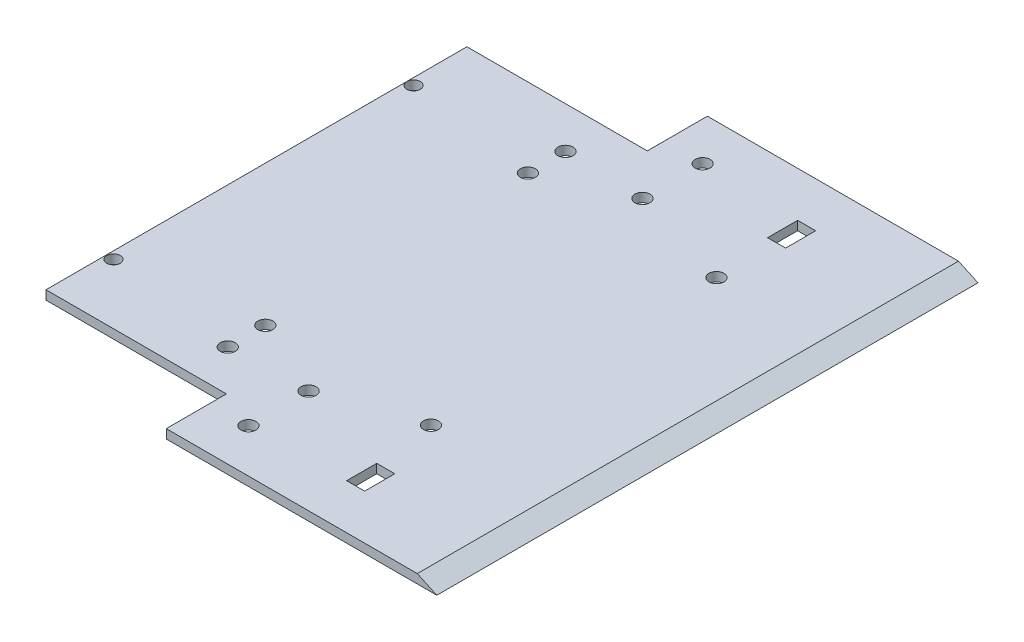
ISO-10303-21;
HEADER;
FILE_DESCRIPTION(('STEP AP214'),'2;1');
FILE_NAME('part.step','',(''),(''),'','','');
FILE_SCHEMA(('AUTOMOTIVE_DESIGN { 1 0 10303 214 1 1 1 1 }'));
ENDSEC;
DATA;
#1=APPLICATION_CONTEXT('core data for automotive mechanical design processes');
#2=APPLICATION_PROTOCOL_DEFINITION('international standard','automotive_design',2000,#1);
#3=PRODUCT_CONTEXT('',#1,'mechanical');
#4=PRODUCT('Part','Part','',(#3));
#5=PRODUCT_RELATED_PRODUCT_CATEGORY('part','',(#4));
#6=PRODUCT_DEFINITION_FORMATION('','',#4);
#7=PRODUCT_DEFINITION_CONTEXT('part definition',#1,'design');
#8=PRODUCT_DEFINITION('design','',#6,#7);
#9=PRODUCT_DEFINITION_SHAPE('','',#8);
#10=(LENGTH_UNIT() NAMED_UNIT(*) SI_UNIT(.MILLI.,.METRE.));
#11=(NAMED_UNIT(*) PLANE_ANGLE_UNIT() SI_UNIT($,.RADIAN.));
#12=(NAMED_UNIT(*) SI_UNIT($,.STERADIAN.) SOLID_ANGLE_UNIT());
#13=UNCERTAINTY_MEASURE_WITH_UNIT(LENGTH_MEASURE(1.E-05),#10,'distance_accuracy_value','');
#14=(GEOMETRIC_REPRESENTATION_CONTEXT(3) GLOBAL_UNCERTAINTY_ASSIGNED_CONTEXT((#13)) GLOBAL_UNIT_ASSIGNED_CONTEXT((#10,
#11,#12)) REPRESENTATION_CONTEXT('',''));
#15=CARTESIAN_POINT('',(0.,0.,0.));
#16=DIRECTION('',(0.,0.,1.));
#17=DIRECTION('',(1.,0.,0.));
#18=AXIS2_PLACEMENT_3D('',#15,#16,#17);
#19=CARTESIAN_POINT('',(0.,3.,-65.0000000000001));
#20=DIRECTION('',(0.,0.,1.));
#21=DIRECTION('',(1.,0.,0.));
#22=AXIS2_PLACEMENT_3D('',#19,#20,#21);
#23=PLANE('',#22);
#24=DIRECTION('',(-1.,0.,0.));
#25=VECTOR('',#24,1.);
#26=CARTESIAN_POINT('',(0.,0.,-65.0000000000001));
#27=LINE('',#26,#25);
#28=CARTESIAN_POINT('',(36.,0.,-65.0000000000001));
#29=VERTEX_POINT('',#28);
#30=CARTESIAN_POINT('',(30.,0.,-65.0000000000001));
#31=VERTEX_POINT('',#30);
#32=EDGE_CURVE('E252',#29,#31,#27,.T.);
#33=ORIENTED_EDGE('',*,*,#32,.T.);
#34=DIRECTION('',(0.,-1.,0.));
#35=VECTOR('',#34,1.);
#36=CARTESIAN_POINT('',(30.,3.,-65.0000000000001));
#37=LINE('',#36,#35);
#38=CARTESIAN_POINT('',(30.,3.,-65.0000000000001));
#39=VERTEX_POINT('',#38);
#40=EDGE_CURVE('E11',#39,#31,#37,.T.);
#41=ORIENTED_EDGE('',*,*,#40,.F.);
#42=DIRECTION('',(-1.,0.,0.));
#43=VECTOR('',#42,1.);
#44=CARTESIAN_POINT('',(0.,3.,-65.0000000000001));
#45=LINE('',#44,#43);
#46=CARTESIAN_POINT('',(36.,3.,-65.0000000000001));
#47=VERTEX_POINT('',#46);
#48=EDGE_CURVE('E162',#47,#39,#45,.T.);
#49=ORIENTED_EDGE('',*,*,#48,.F.);
#50=DIRECTION('',(0.,-1.,0.));
#51=VECTOR('',#50,1.);
#52=CARTESIAN_POINT('',(36.,3.,-65.0000000000001));
#53=LINE('',#52,#51);
#54=EDGE_CURVE('E60',#47,#29,#53,.T.);
#55=ORIENTED_EDGE('',*,*,#54,.T.);
#56=EDGE_LOOP('',(#33,#41,#49,#55));
#57=FACE_BOUND('',#56,.T.);
#58=ADVANCED_FACE('F41',(#57),#23,.F.);
#59=CARTESIAN_POINT('',(30.,3.,0.));
#60=DIRECTION('',(-1.,0.,0.));
#61=DIRECTION('',(0.,0.,1.));
#62=AXIS2_PLACEMENT_3D('',#59,#60,#61);
#63=PLANE('',#62);
#64=DIRECTION('',(0.,0.,-1.));
#65=VECTOR('',#64,1.);
#66=CARTESIAN_POINT('',(30.,0.,0.));
#67=LINE('',#66,#65);
#68=CARTESIAN_POINT('',(30.,0.,-75.0000000000001));
#69=VERTEX_POINT('',#68);
#70=EDGE_CURVE('E168',#31,#69,#67,.T.);
#71=ORIENTED_EDGE('',*,*,#70,.T.);
#72=DIRECTION('',(0.,-1.,0.));
#73=VECTOR('',#72,1.);
#74=CARTESIAN_POINT('',(30.,3.,-75.0000000000001));
#75=LINE('',#74,#73);
#76=CARTESIAN_POINT('',(30.,3.,-75.0000000000001));
#77=VERTEX_POINT('',#76);
#78=EDGE_CURVE('E51',#77,#69,#75,.T.);
#79=ORIENTED_EDGE('',*,*,#78,.F.);
#80=DIRECTION('',(0.,0.,-1.));
#81=VECTOR('',#80,1.);
#82=CARTESIAN_POINT('',(30.,3.,0.));
#83=LINE('',#82,#81);
#84=EDGE_CURVE('E156',#39,#77,#83,.T.);
#85=ORIENTED_EDGE('',*,*,#84,.F.);
#86=ORIENTED_EDGE('',*,*,#40,.T.);
#87=EDGE_LOOP('',(#71,#79,#85,#86));
#88=FACE_BOUND('',#87,.T.);
#89=ADVANCED_FACE('F167',(#88),#63,.F.);
#90=CARTESIAN_POINT('',(0.,3.,-75.0000000000001));
#91=DIRECTION('',(0.,0.,1.));
#92=DIRECTION('',(1.,0.,0.));
#93=AXIS2_PLACEMENT_3D('',#90,#91,#92);
#94=PLANE('',#93);
#95=DIRECTION('',(-1.,0.,0.));
#96=VECTOR('',#95,1.);
#97=CARTESIAN_POINT('',(0.,0.,-75.0000000000001));
#98=LINE('',#97,#96);
#99=CARTESIAN_POINT('',(36.,0.,-75.0000000000001));
#100=VERTEX_POINT('',#99);
#101=EDGE_CURVE('E255',#100,#69,#98,.T.);
#102=ORIENTED_EDGE('',*,*,#101,.F.);
#103=DIRECTION('',(0.,-1.,0.));
#104=VECTOR('',#103,1.);
#105=CARTESIAN_POINT('',(36.,3.,-75.0000000000001));
#106=LINE('',#105,#104);
#107=CARTESIAN_POINT('',(36.,3.,-75.0000000000001));
#108=VERTEX_POINT('',#107);
#109=EDGE_CURVE('E108',#108,#100,#106,.T.);
#110=ORIENTED_EDGE('',*,*,#109,.F.);
#111=DIRECTION('',(-1.,0.,0.));
#112=VECTOR('',#111,1.);
#113=CARTESIAN_POINT('',(0.,3.,-75.0000000000001));
#114=LINE('',#113,#112);
#115=EDGE_CURVE('E161',#108,#77,#114,.T.);
#116=ORIENTED_EDGE('',*,*,#115,.T.);
#117=ORIENTED_EDGE('',*,*,#78,.T.);
#118=EDGE_LOOP('',(#102,#110,#116,#117));
#119=FACE_BOUND('',#118,.T.);
#120=ADVANCED_FACE('F172',(#119),#94,.T.);
#121=CARTESIAN_POINT('',(-15.,3.,0.));
#122=DIRECTION('',(-1.,0.,0.));
#123=DIRECTION('',(0.,0.,1.));
#124=AXIS2_PLACEMENT_3D('',#121,#122,#123);
#125=PLANE('',#124);
#126=DIRECTION('',(0.,0.,-1.));
#127=VECTOR('',#126,1.);
#128=CARTESIAN_POINT('',(-15.,0.,0.));
#129=LINE('',#128,#127);
#130=CARTESIAN_POINT('',(-15.,0.,90.));
#131=VERTEX_POINT('',#130);
#132=CARTESIAN_POINT('',(-15.,0.,70.0000000000001));
#133=VERTEX_POINT('',#132);
#134=EDGE_CURVE('E228',#131,#133,#129,.T.);
#135=ORIENTED_EDGE('',*,*,#134,.F.);
#136=DIRECTION('',(0.,-1.,0.));
#137=VECTOR('',#136,1.);
#138=CARTESIAN_POINT('',(-15.,3.,90.));
#139=LINE('',#138,#137);
#140=CARTESIAN_POINT('',(-15.,3.,90.));
#141=VERTEX_POINT('',#140);
#142=EDGE_CURVE('E262',#141,#131,#139,.T.);
#143=ORIENTED_EDGE('',*,*,#142,.F.);
#144=DIRECTION('',(0.,0.,-1.));
#145=VECTOR('',#144,1.);
#146=CARTESIAN_POINT('',(-15.,3.,0.));
#147=LINE('',#146,#145);
#148=CARTESIAN_POINT('',(-15.,3.,70.0000000000001));
#149=VERTEX_POINT('',#148);
#150=EDGE_CURVE('E694',#141,#149,#147,.T.);
#151=ORIENTED_EDGE('',*,*,#150,.T.);
#152=DIRECTION('',(0.,-1.,0.));
#153=VECTOR('',#152,1.);
#154=CARTESIAN_POINT('',(-15.,3.,70.0000000000001));
#155=LINE('',#154,#153);
#156=EDGE_CURVE('E264',#149,#133,#155,.T.);
#157=ORIENTED_EDGE('',*,*,#156,.T.);
#158=EDGE_LOOP('',(#135,#143,#151,#157));
#159=FACE_BOUND('',#158,.T.);
#160=ADVANCED_FACE('F339',(#159),#125,.T.);
#161=CARTESIAN_POINT('',(0.,3.,90.));
#162=DIRECTION('',(0.,0.,1.));
#163=DIRECTION('',(1.,0.,0.));
#164=AXIS2_PLACEMENT_3D('',#161,#162,#163);
#165=PLANE('',#164);
#166=DIRECTION('',(0.907812771435628,-0.419375693165881,0.));
#167=VECTOR('',#166,1.);
#168=CARTESIAN_POINT('',(68.5059700438346,3.,90.));
#169=LINE('',#168,#167);
#170=CARTESIAN_POINT('',(68.5059700438346,3.,90.));
#171=VERTEX_POINT('',#170);
#172=CARTESIAN_POINT('',(75.,0.,90.));
#173=VERTEX_POINT('',#172);
#174=EDGE_CURVE('E739',#171,#173,#169,.T.);
#175=ORIENTED_EDGE('',*,*,#174,.F.);
#176=DIRECTION('',(-1.,0.,0.));
#177=VECTOR('',#176,1.);
#178=CARTESIAN_POINT('',(0.,3.,90.));
#179=LINE('',#178,#177);
#180=EDGE_CURVE('E692',#171,#141,#179,.T.);
#181=ORIENTED_EDGE('',*,*,#180,.T.);
#182=ORIENTED_EDGE('',*,*,#142,.T.);
#183=DIRECTION('',(-1.,0.,0.));
#184=VECTOR('',#183,1.);
#185=CARTESIAN_POINT('',(0.,0.,90.));
#186=LINE('',#185,#184);
#187=EDGE_CURVE('E231',#173,#131,#186,.T.);
#188=ORIENTED_EDGE('',*,*,#187,.F.);
#189=EDGE_LOOP('',(#175,#181,#182,#188));
#190=FACE_BOUND('',#189,.T.);
#191=ADVANCED_FACE('F335',(#190),#165,.T.);
#192=CARTESIAN_POINT('',(0.,3.,-90.));
#193=DIRECTION('',(0.,0.,1.));
#194=DIRECTION('',(1.,0.,0.));
#195=AXIS2_PLACEMENT_3D('',#192,#193,#194);
#196=PLANE('',#195);
#197=DIRECTION('',(-1.,0.,0.));
#198=VECTOR('',#197,1.);
#199=CARTESIAN_POINT('',(0.,3.,-90.));
#200=LINE('',#199,#198);
#201=CARTESIAN_POINT('',(68.5059700438346,3.,-90.));
#202=VERTEX_POINT('',#201);
#203=CARTESIAN_POINT('',(-15.,3.,-90.));
#204=VERTEX_POINT('',#203);
#205=EDGE_CURVE('E690',#202,#204,#200,.T.);
#206=ORIENTED_EDGE('',*,*,#205,.F.);
#207=DIRECTION('',(0.907812771435628,-0.419375693165882,0.));
#208=VECTOR('',#207,1.);
#209=CARTESIAN_POINT('',(12.0485540705203,29.0812236874793,-90.));
#210=LINE('',#209,#208);
#211=CARTESIAN_POINT('',(75.,0.,-90.));
#212=VERTEX_POINT('',#211);
#213=EDGE_CURVE('E183',#202,#212,#210,.T.);
#214=ORIENTED_EDGE('',*,*,#213,.T.);
#215=DIRECTION('',(-1.,0.,0.));
#216=VECTOR('',#215,1.);
#217=CARTESIAN_POINT('',(0.,0.,-90.));
#218=LINE('',#217,#216);
#219=CARTESIAN_POINT('',(-15.,0.,-90.));
#220=VERTEX_POINT('',#219);
#221=EDGE_CURVE('E237',#212,#220,#218,.T.);
#222=ORIENTED_EDGE('',*,*,#221,.T.);
#223=DIRECTION('',(0.,-1.,0.));
#224=VECTOR('',#223,1.);
#225=CARTESIAN_POINT('',(-15.,3.,-90.));
#226=LINE('',#225,#224);
#227=EDGE_CURVE('E272',#204,#220,#226,.T.);
#228=ORIENTED_EDGE('',*,*,#227,.F.);
#229=EDGE_LOOP('',(#206,#214,#222,#228));
#230=FACE_BOUND('',#229,.T.);
#231=ADVANCED_FACE('F331',(#230),#196,.F.);
#232=CARTESIAN_POINT('',(-15.,3.,0.));
#233=DIRECTION('',(1.,0.,0.));
#234=DIRECTION('',(0.,0.,-1.));
#235=AXIS2_PLACEMENT_3D('',#232,#233,#234);
#236=PLANE('',#235);
#237=DIRECTION('',(0.,0.,1.));
#238=VECTOR('',#237,1.);
#239=CARTESIAN_POINT('',(-15.,0.,0.));
#240=LINE('',#239,#238);
#241=CARTESIAN_POINT('',(-15.,0.,-70.));
#242=VERTEX_POINT('',#241);
#243=EDGE_CURVE('E240',#220,#242,#240,.T.);
#244=ORIENTED_EDGE('',*,*,#243,.T.);
#245=DIRECTION('',(0.,-1.,0.));
#246=VECTOR('',#245,1.);
#247=CARTESIAN_POINT('',(-15.,3.,-70.));
#248=LINE('',#247,#246);
#249=CARTESIAN_POINT('',(-15.,3.,-70.));
#250=VERTEX_POINT('',#249);
#251=EDGE_CURVE('E270',#250,#242,#248,.T.);
#252=ORIENTED_EDGE('',*,*,#251,.F.);
#253=DIRECTION('',(0.,0.,1.));
#254=VECTOR('',#253,1.);
#255=CARTESIAN_POINT('',(-15.,3.,0.));
#256=LINE('',#255,#254);
#257=EDGE_CURVE('E688',#204,#250,#256,.T.);
#258=ORIENTED_EDGE('',*,*,#257,.F.);
#259=ORIENTED_EDGE('',*,*,#227,.T.);
#260=EDGE_LOOP('',(#244,#252,#258,#259));
#261=FACE_BOUND('',#260,.T.);
#262=ADVANCED_FACE('F327',(#261),#236,.F.);
#263=CARTESIAN_POINT('',(0.,3.,-70.));
#264=DIRECTION('',(0.,0.,-1.));
#265=DIRECTION('',(-1.,0.,0.));
#266=AXIS2_PLACEMENT_3D('',#263,#264,#265);
#267=PLANE('',#266);
#268=DIRECTION('',(1.,0.,0.));
#269=VECTOR('',#268,1.);
#270=CARTESIAN_POINT('',(0.,0.,-70.));
#271=LINE('',#270,#269);
#272=CARTESIAN_POINT('',(-75.,0.,-70.));
#273=VERTEX_POINT('',#272);
#274=EDGE_CURVE('E243',#273,#242,#271,.T.);
#275=ORIENTED_EDGE('',*,*,#274,.F.);
#276=DIRECTION('',(0.,-1.,0.));
#277=VECTOR('',#276,1.);
#278=CARTESIAN_POINT('',(-75.,3.,-70.));
#279=LINE('',#278,#277);
#280=CARTESIAN_POINT('',(-75.,3.,-70.));
#281=VERTEX_POINT('',#280);
#282=EDGE_CURVE('E268',#281,#273,#279,.T.);
#283=ORIENTED_EDGE('',*,*,#282,.F.);
#284=DIRECTION('',(1.,0.,0.));
#285=VECTOR('',#284,1.);
#286=CARTESIAN_POINT('',(0.,3.,-70.));
#287=LINE('',#286,#285);
#288=EDGE_CURVE('E685',#281,#250,#287,.T.);
#289=ORIENTED_EDGE('',*,*,#288,.T.);
#290=ORIENTED_EDGE('',*,*,#251,.T.);
#291=EDGE_LOOP('',(#275,#283,#289,#290));
#292=FACE_BOUND('',#291,.T.);
#293=ADVANCED_FACE('F323',(#292),#267,.T.);
#294=CARTESIAN_POINT('',(-75.,3.,0.));
#295=DIRECTION('',(-1.,0.,0.));
#296=DIRECTION('',(0.,0.,1.));
#297=AXIS2_PLACEMENT_3D('',#294,#295,#296);
#298=PLANE('',#297);
#299=DIRECTION('',(0.,0.,-1.));
#300=VECTOR('',#299,1.);
#301=CARTESIAN_POINT('',(-75.,0.,0.));
#302=LINE('',#301,#300);
#303=CARTESIAN_POINT('',(-75.,0.,70.0000000000001));
#304=VERTEX_POINT('',#303);
#305=EDGE_CURVE('E246',#304,#273,#302,.T.);
#306=ORIENTED_EDGE('',*,*,#305,.F.);
#307=DIRECTION('',(0.,-1.,0.));
#308=VECTOR('',#307,1.);
#309=CARTESIAN_POINT('',(-75.,3.,70.0000000000001));
#310=LINE('',#309,#308);
#311=CARTESIAN_POINT('',(-75.,3.,70.0000000000001));
#312=VERTEX_POINT('',#311);
#313=EDGE_CURVE('E266',#312,#304,#310,.T.);
#314=ORIENTED_EDGE('',*,*,#313,.F.);
#315=DIRECTION('',(0.,0.,-1.));
#316=VECTOR('',#315,1.);
#317=CARTESIAN_POINT('',(-75.,3.,0.));
#318=LINE('',#317,#316);
#319=EDGE_CURVE('E680',#312,#281,#318,.T.);
#320=ORIENTED_EDGE('',*,*,#319,.T.);
#321=ORIENTED_EDGE('',*,*,#282,.T.);
#322=EDGE_LOOP('',(#306,#314,#320,#321));
#323=FACE_BOUND('',#322,.T.);
#324=ADVANCED_FACE('F320',(#323),#298,.T.);
#325=CARTESIAN_POINT('',(0.,3.,65.0000000000001));
#326=DIRECTION('',(0.,0.,1.));
#327=DIRECTION('',(1.,0.,0.));
#328=AXIS2_PLACEMENT_3D('',#325,#326,#327);
#329=PLANE('',#328);
#330=DIRECTION('',(-1.,0.,0.));
#331=VECTOR('',#330,1.);
#332=CARTESIAN_POINT('',(0.,0.,65.0000000000001));
#333=LINE('',#332,#331);
#334=CARTESIAN_POINT('',(36.,0.,65.0000000000001));
#335=VERTEX_POINT('',#334);
#336=CARTESIAN_POINT('',(30.,0.,65.0000000000001));
#337=VERTEX_POINT('',#336);
#338=EDGE_CURVE('E216',#335,#337,#333,.T.);
#339=ORIENTED_EDGE('',*,*,#338,.F.);
#340=DIRECTION('',(0.,-1.,0.));
#341=VECTOR('',#340,1.);
#342=CARTESIAN_POINT('',(36.,3.,65.0000000000001));
#343=LINE('',#342,#341);
#344=CARTESIAN_POINT('',(36.,3.,65.0000000000001));
#345=VERTEX_POINT('',#344);
#346=EDGE_CURVE('E45',#345,#335,#343,.T.);
#347=ORIENTED_EDGE('',*,*,#346,.F.);
#348=DIRECTION('',(-1.,0.,0.));
#349=VECTOR('',#348,1.);
#350=CARTESIAN_POINT('',(0.,3.,65.0000000000001));
#351=LINE('',#350,#349);
#352=CARTESIAN_POINT('',(30.,3.,65.0000000000001));
#353=VERTEX_POINT('',#352);
#354=EDGE_CURVE('E293',#345,#353,#351,.T.);
#355=ORIENTED_EDGE('',*,*,#354,.T.);
#356=DIRECTION('',(0.,-1.,0.));
#357=VECTOR('',#356,1.);
#358=CARTESIAN_POINT('',(30.,3.,65.0000000000001));
#359=LINE('',#358,#357);
#360=EDGE_CURVE('E175',#353,#337,#359,.T.);
#361=ORIENTED_EDGE('',*,*,#360,.T.);
#362=EDGE_LOOP('',(#339,#347,#355,#361));
#363=FACE_BOUND('',#362,.T.);
#364=ADVANCED_FACE('F292',(#363),#329,.T.);
#365=CARTESIAN_POINT('',(35.9999999999998,3.,0.));
#366=DIRECTION('',(1.,0.,0.));
#367=DIRECTION('',(0.,0.,-1.));
#368=AXIS2_PLACEMENT_3D('',#365,#366,#367);
#369=PLANE('',#368);
#370=DIRECTION('',(0.,0.,1.));
#371=VECTOR('',#370,1.);
#372=CARTESIAN_POINT('',(35.9999999999998,0.,0.));
#373=LINE('',#372,#371);
#374=CARTESIAN_POINT('',(36.,0.,75.0000000000001));
#375=VERTEX_POINT('',#374);
#376=EDGE_CURVE('E219',#335,#375,#373,.T.);
#377=ORIENTED_EDGE('',*,*,#376,.T.);
#378=DIRECTION('',(0.,-1.,0.));
#379=VECTOR('',#378,1.);
#380=CARTESIAN_POINT('',(36.,3.,75.0000000000001));
#381=LINE('',#380,#379);
#382=CARTESIAN_POINT('',(36.,3.,75.0000000000001));
#383=VERTEX_POINT('',#382);
#384=EDGE_CURVE('E278',#383,#375,#381,.T.);
#385=ORIENTED_EDGE('',*,*,#384,.F.);
#386=DIRECTION('',(0.,0.,1.));
#387=VECTOR('',#386,1.);
#388=CARTESIAN_POINT('',(35.9999999999998,3.,0.));
#389=LINE('',#388,#387);
#390=EDGE_CURVE('E286',#345,#383,#389,.T.);
#391=ORIENTED_EDGE('',*,*,#390,.F.);
#392=ORIENTED_EDGE('',*,*,#346,.T.);
#393=EDGE_LOOP('',(#377,#385,#391,#392));
#394=FACE_BOUND('',#393,.T.);
#395=ADVANCED_FACE('F284',(#394),#369,.F.);
#396=CARTESIAN_POINT('',(0.,3.,75.0000000000001));
#397=DIRECTION('',(0.,0.,1.));
#398=DIRECTION('',(1.,0.,0.));
#399=AXIS2_PLACEMENT_3D('',#396,#397,#398);
#400=PLANE('',#399);
#401=DIRECTION('',(-1.,0.,0.));
#402=VECTOR('',#401,1.);
#403=CARTESIAN_POINT('',(0.,0.,75.0000000000001));
#404=LINE('',#403,#402);
#405=CARTESIAN_POINT('',(30.,0.,75.0000000000001));
#406=VERTEX_POINT('',#405);
#407=EDGE_CURVE('E222',#375,#406,#404,.T.);
#408=ORIENTED_EDGE('',*,*,#407,.T.);
#409=DIRECTION('',(0.,-1.,0.));
#410=VECTOR('',#409,1.);
#411=CARTESIAN_POINT('',(30.,3.,75.0000000000001));
#412=LINE('',#411,#410);
#413=CARTESIAN_POINT('',(30.,3.,75.0000000000001));
#414=VERTEX_POINT('',#413);
#415=EDGE_CURVE('E277',#414,#406,#412,.T.);
#416=ORIENTED_EDGE('',*,*,#415,.F.);
#417=DIRECTION('',(-1.,0.,0.));
#418=VECTOR('',#417,1.);
#419=CARTESIAN_POINT('',(0.,3.,75.0000000000001));
#420=LINE('',#419,#418);
#421=EDGE_CURVE('E698',#383,#414,#420,.T.);
#422=ORIENTED_EDGE('',*,*,#421,.F.);
#423=ORIENTED_EDGE('',*,*,#384,.T.);
#424=EDGE_LOOP('',(#408,#416,#422,#423));
#425=FACE_BOUND('',#424,.T.);
#426=ADVANCED_FACE('F300',(#425),#400,.F.);
#427=CARTESIAN_POINT('',(0.,3.,70.0000000000001));
#428=DIRECTION('',(0.,0.,-1.));
#429=DIRECTION('',(-1.,0.,0.));
#430=AXIS2_PLACEMENT_3D('',#427,#428,#429);
#431=PLANE('',#430);
#432=DIRECTION('',(1.,0.,0.));
#433=VECTOR('',#432,1.);
#434=CARTESIAN_POINT('',(0.,0.,70.0000000000001));
#435=LINE('',#434,#433);
#436=EDGE_CURVE('E249',#304,#133,#435,.T.);
#437=ORIENTED_EDGE('',*,*,#436,.T.);
#438=ORIENTED_EDGE('',*,*,#156,.F.);
#439=DIRECTION('',(1.,0.,0.));
#440=VECTOR('',#439,1.);
#441=CARTESIAN_POINT('',(0.,3.,70.0000000000001));
#442=LINE('',#441,#440);
#443=EDGE_CURVE('E679',#312,#149,#442,.T.);
#444=ORIENTED_EDGE('',*,*,#443,.F.);
#445=ORIENTED_EDGE('',*,*,#313,.T.);
#446=EDGE_LOOP('',(#437,#438,#444,#445));
#447=FACE_BOUND('',#446,.T.);
#448=ADVANCED_FACE('F302',(#447),#431,.F.);
#449=CARTESIAN_POINT('',(29.9999999999998,3.,0.));
#450=DIRECTION('',(1.,0.,0.));
#451=DIRECTION('',(0.,0.,-1.));
#452=AXIS2_PLACEMENT_3D('',#449,#450,#451);
#453=PLANE('',#452);
#454=DIRECTION('',(0.,0.,1.));
#455=VECTOR('',#454,1.);
#456=CARTESIAN_POINT('',(29.9999999999998,0.,0.));
#457=LINE('',#456,#455);
#458=EDGE_CURVE('E225',#337,#406,#457,.T.);
#459=ORIENTED_EDGE('',*,*,#458,.F.);
#460=ORIENTED_EDGE('',*,*,#360,.F.);
#461=DIRECTION('',(0.,0.,1.));
#462=VECTOR('',#461,1.);
#463=CARTESIAN_POINT('',(29.9999999999998,3.,0.));
#464=LINE('',#463,#462);
#465=EDGE_CURVE('E298',#353,#414,#464,.T.);
#466=ORIENTED_EDGE('',*,*,#465,.T.);
#467=ORIENTED_EDGE('',*,*,#415,.T.);
#468=EDGE_LOOP('',(#459,#460,#466,#467));
#469=FACE_BOUND('',#468,.T.);
#470=ADVANCED_FACE('F297',(#469),#453,.T.);
#471=CARTESIAN_POINT('',(-2.11162999050504,3.,-55.5));
#472=DIRECTION('',(0.,-1.,0.));
#473=DIRECTION('',(0.,0.,-1.));
#474=AXIS2_PLACEMENT_3D('',#471,#472,#473);
#475=CYLINDRICAL_SURFACE('',#474,2.5);
#476=CARTESIAN_POINT('',(-2.11162999050504,3.,-55.5));
#477=DIRECTION('',(0.,1.,0.));
#478=DIRECTION('',(0.,0.,1.));
#479=AXIS2_PLACEMENT_3D('',#476,#477,#478);
#480=CIRCLE('',#479,2.5);
#481=CARTESIAN_POINT('',(-2.11162999050504,3.,-53.));
#482=VERTEX_POINT('',#481);
#483=EDGE_CURVE('E702',#482,#482,#480,.T.);
#484=ORIENTED_EDGE('',*,*,#483,.T.);
#485=EDGE_LOOP('',(#484));
#486=FACE_BOUND('',#485,.T.);
#487=CARTESIAN_POINT('',(-2.11162999050504,0.,-55.5));
#488=DIRECTION('',(0.,1.,0.));
#489=DIRECTION('',(0.,0.,1.));
#490=AXIS2_PLACEMENT_3D('',#487,#488,#489);
#491=CIRCLE('',#490,2.5);
#492=CARTESIAN_POINT('',(-2.11162999050504,0.,-53.));
#493=VERTEX_POINT('',#492);
#494=EDGE_CURVE('E213',#493,#493,#491,.T.);
#495=ORIENTED_EDGE('',*,*,#494,.F.);
#496=EDGE_LOOP('',(#495));
#497=FACE_BOUND('',#496,.T.);
#498=ADVANCED_FACE('F344',(#486,#497),#475,.F.);
#499=CARTESIAN_POINT('',(-2.11162999050504,3.,-75.5));
#500=DIRECTION('',(0.,-1.,0.));
#501=DIRECTION('',(0.,0.,-1.));
#502=AXIS2_PLACEMENT_3D('',#499,#500,#501);
#503=CYLINDRICAL_SURFACE('',#502,2.5);
#504=CARTESIAN_POINT('',(-2.11162999050504,3.,-75.5));
#505=DIRECTION('',(0.,1.,0.));
#506=DIRECTION('',(0.,0.,1.));
#507=AXIS2_PLACEMENT_3D('',#504,#505,#506);
#508=CIRCLE('',#507,2.5);
#509=CARTESIAN_POINT('',(-2.11162999050504,3.,-73.));
#510=VERTEX_POINT('',#509);
#511=EDGE_CURVE('E704',#510,#510,#508,.T.);
#512=ORIENTED_EDGE('',*,*,#511,.T.);
#513=EDGE_LOOP('',(#512));
#514=FACE_BOUND('',#513,.T.);
#515=CARTESIAN_POINT('',(-2.11162999050504,0.,-75.5));
#516=DIRECTION('',(0.,1.,0.));
#517=DIRECTION('',(0.,0.,1.));
#518=AXIS2_PLACEMENT_3D('',#515,#516,#517);
#519=CIRCLE('',#518,2.5);
#520=CARTESIAN_POINT('',(-2.11162999050504,0.,-73.));
#521=VERTEX_POINT('',#520);
#522=EDGE_CURVE('E210',#521,#521,#519,.T.);
#523=ORIENTED_EDGE('',*,*,#522,.F.);
#524=EDGE_LOOP('',(#523));
#525=FACE_BOUND('',#524,.T.);
#526=ADVANCED_FACE('F348',(#514,#525),#503,.F.);
#527=CARTESIAN_POINT('',(-2.16153912830007,3.,55.5));
#528=DIRECTION('',(0.,-1.,0.));
#529=DIRECTION('',(0.,0.,-1.));
#530=AXIS2_PLACEMENT_3D('',#527,#528,#529);
#531=CYLINDRICAL_SURFACE('',#530,2.5);
#532=CARTESIAN_POINT('',(-2.16153912830007,3.,55.5));
#533=DIRECTION('',(0.,1.,0.));
#534=DIRECTION('',(0.,0.,1.));
#535=AXIS2_PLACEMENT_3D('',#532,#533,#534);
#536=CIRCLE('',#535,2.5);
#537=CARTESIAN_POINT('',(-2.16153912830007,3.,58.));
#538=VERTEX_POINT('',#537);
#539=EDGE_CURVE('E707',#538,#538,#536,.T.);
#540=ORIENTED_EDGE('',*,*,#539,.T.);
#541=EDGE_LOOP('',(#540));
#542=FACE_BOUND('',#541,.T.);
#543=CARTESIAN_POINT('',(-2.16153912830007,0.,55.5));
#544=DIRECTION('',(0.,1.,0.));
#545=DIRECTION('',(0.,0.,1.));
#546=AXIS2_PLACEMENT_3D('',#543,#544,#545);
#547=CIRCLE('',#546,2.5);
#548=CARTESIAN_POINT('',(-2.16153912830007,0.,58.));
#549=VERTEX_POINT('',#548);
#550=EDGE_CURVE('E207',#549,#549,#547,.T.);
#551=ORIENTED_EDGE('',*,*,#550,.F.);
#552=EDGE_LOOP('',(#551));
#553=FACE_BOUND('',#552,.T.);
#554=ADVANCED_FACE('F354',(#542,#553),#531,.F.);
#555=CARTESIAN_POINT('',(-2.16153912830006,3.,75.5));
#556=DIRECTION('',(0.,-1.,0.));
#557=DIRECTION('',(0.,0.,-1.));
#558=AXIS2_PLACEMENT_3D('',#555,#556,#557);
#559=CYLINDRICAL_SURFACE('',#558,2.5);
#560=CARTESIAN_POINT('',(-2.16153912830006,3.,75.5));
#561=DIRECTION('',(0.,1.,0.));
#562=DIRECTION('',(0.,0.,1.));
#563=AXIS2_PLACEMENT_3D('',#560,#561,#562);
#564=CIRCLE('',#563,2.5);
#565=CARTESIAN_POINT('',(-2.16153912830006,3.,78.));
#566=VERTEX_POINT('',#565);
#567=EDGE_CURVE('E710',#566,#566,#564,.T.);
#568=ORIENTED_EDGE('',*,*,#567,.T.);
#569=EDGE_LOOP('',(#568));
#570=FACE_BOUND('',#569,.T.);
#571=CARTESIAN_POINT('',(-2.16153912830006,0.,75.5));
#572=DIRECTION('',(0.,1.,0.));
#573=DIRECTION('',(0.,0.,1.));
#574=AXIS2_PLACEMENT_3D('',#571,#572,#573);
#575=CIRCLE('',#574,2.5);
#576=CARTESIAN_POINT('',(-2.16153912830006,0.,78.));
#577=VERTEX_POINT('',#576);
#578=EDGE_CURVE('E204',#577,#577,#575,.T.);
#579=ORIENTED_EDGE('',*,*,#578,.F.);
#580=EDGE_LOOP('',(#579));
#581=FACE_BOUND('',#580,.T.);
#582=ADVANCED_FACE('F363',(#570,#581),#559,.F.);
#583=CARTESIAN_POINT('',(33.,3.,-45.));
#584=DIRECTION('',(0.,-1.,0.));
#585=DIRECTION('',(0.,0.,-1.));
#586=AXIS2_PLACEMENT_3D('',#583,#584,#585);
#587=CYLINDRICAL_SURFACE('',#586,2.5);
#588=CARTESIAN_POINT('',(33.,3.,-45.));
#589=DIRECTION('',(0.,1.,0.));
#590=DIRECTION('',(0.,0.,1.));
#591=AXIS2_PLACEMENT_3D('',#588,#589,#590);
#592=CIRCLE('',#591,2.5);
#593=CARTESIAN_POINT('',(33.,3.,-42.5));
#594=VERTEX_POINT('',#593);
#595=EDGE_CURVE('E713',#594,#594,#592,.T.);
#596=ORIENTED_EDGE('',*,*,#595,.T.);
#597=EDGE_LOOP('',(#596));
#598=FACE_BOUND('',#597,.T.);
#599=CARTESIAN_POINT('',(33.,0.,-45.));
#600=DIRECTION('',(0.,1.,0.));
#601=DIRECTION('',(0.,0.,1.));
#602=AXIS2_PLACEMENT_3D('',#599,#600,#601);
#603=CIRCLE('',#602,2.5);
#604=CARTESIAN_POINT('',(33.,0.,-42.5));
#605=VERTEX_POINT('',#604);
#606=EDGE_CURVE('E201',#605,#605,#603,.T.);
#607=ORIENTED_EDGE('',*,*,#606,.F.);
#608=EDGE_LOOP('',(#607));
#609=FACE_BOUND('',#608,.T.);
#610=ADVANCED_FACE('F367',(#598,#609),#587,.F.);
#611=CARTESIAN_POINT('',(28.0394418987928,3.,45.));
#612=DIRECTION('',(0.,-1.,0.));
#613=DIRECTION('',(0.,0.,-1.));
#614=AXIS2_PLACEMENT_3D('',#611,#612,#613);
#615=CYLINDRICAL_SURFACE('',#614,2.50045852486626);
#616=CARTESIAN_POINT('',(28.0394418987928,3.,45.));
#617=DIRECTION('',(0.,1.,0.));
#618=DIRECTION('',(0.,0.,1.));
#619=AXIS2_PLACEMENT_3D('',#616,#617,#618);
#620=CIRCLE('',#619,2.50045852486626);
#621=CARTESIAN_POINT('',(28.0394418987928,3.,47.5004585248663));
#622=VERTEX_POINT('',#621);
#623=EDGE_CURVE('E716',#622,#622,#620,.T.);
#624=ORIENTED_EDGE('',*,*,#623,.T.);
#625=EDGE_LOOP('',(#624));
#626=FACE_BOUND('',#625,.T.);
#627=CARTESIAN_POINT('',(28.0394418987928,0.,45.));
#628=DIRECTION('',(0.,1.,0.));
#629=DIRECTION('',(0.,0.,1.));
#630=AXIS2_PLACEMENT_3D('',#627,#628,#629);
#631=CIRCLE('',#630,2.50045852486626);
#632=CARTESIAN_POINT('',(28.0394418987928,0.,47.5004585248663));
#633=VERTEX_POINT('',#632);
#634=EDGE_CURVE('E198',#633,#633,#631,.T.);
#635=ORIENTED_EDGE('',*,*,#634,.F.);
#636=EDGE_LOOP('',(#635));
#637=FACE_BOUND('',#636,.T.);
#638=ADVANCED_FACE('F371',(#626,#637),#615,.F.);
#639=CARTESIAN_POINT('',(-28.4764987737365,3.,-56.25));
#640=DIRECTION('',(0.,-1.,0.));
#641=DIRECTION('',(0.,0.,-1.));
#642=AXIS2_PLACEMENT_3D('',#639,#640,#641);
#643=CYLINDRICAL_SURFACE('',#642,2.5);
#644=CARTESIAN_POINT('',(-28.4764987737365,3.,-56.25));
#645=DIRECTION('',(0.,1.,0.));
#646=DIRECTION('',(0.,0.,1.));
#647=AXIS2_PLACEMENT_3D('',#644,#645,#646);
#648=CIRCLE('',#647,2.5);
#649=CARTESIAN_POINT('',(-28.4764987737365,3.,-53.75));
#650=VERTEX_POINT('',#649);
#651=EDGE_CURVE('E719',#650,#650,#648,.T.);
#652=ORIENTED_EDGE('',*,*,#651,.T.);
#653=EDGE_LOOP('',(#652));
#654=FACE_BOUND('',#653,.T.);
#655=CARTESIAN_POINT('',(-28.4764987737365,0.,-56.25));
#656=DIRECTION('',(0.,1.,0.));
#657=DIRECTION('',(0.,0.,1.));
#658=AXIS2_PLACEMENT_3D('',#655,#656,#657);
#659=CIRCLE('',#658,2.5);
#660=CARTESIAN_POINT('',(-28.4764987737365,0.,-53.75));
#661=VERTEX_POINT('',#660);
#662=EDGE_CURVE('E195',#661,#661,#659,.T.);
#663=ORIENTED_EDGE('',*,*,#662,.F.);
#664=EDGE_LOOP('',(#663));
#665=FACE_BOUND('',#664,.T.);
#666=ADVANCED_FACE('F375',(#654,#665),#643,.F.);
#667=CARTESIAN_POINT('',(-28.4764987737365,3.,-43.75));
#668=DIRECTION('',(0.,-1.,0.));
#669=DIRECTION('',(0.,0.,-1.));
#670=AXIS2_PLACEMENT_3D('',#667,#668,#669);
#671=CYLINDRICAL_SURFACE('',#670,2.49999999999999);
#672=CARTESIAN_POINT('',(-28.4764987737365,3.,-43.75));
#673=DIRECTION('',(0.,1.,0.));
#674=DIRECTION('',(0.,0.,1.));
#675=AXIS2_PLACEMENT_3D('',#672,#673,#674);
#676=CIRCLE('',#675,2.49999999999999);
#677=CARTESIAN_POINT('',(-28.4764987737365,3.,-41.25));
#678=VERTEX_POINT('',#677);
#679=EDGE_CURVE('E722',#678,#678,#676,.T.);
#680=ORIENTED_EDGE('',*,*,#679,.T.);
#681=EDGE_LOOP('',(#680));
#682=FACE_BOUND('',#681,.T.);
#683=CARTESIAN_POINT('',(-28.4764987737365,0.,-43.75));
#684=DIRECTION('',(0.,1.,0.));
#685=DIRECTION('',(0.,0.,1.));
#686=AXIS2_PLACEMENT_3D('',#683,#684,#685);
#687=CIRCLE('',#686,2.49999999999999);
#688=CARTESIAN_POINT('',(-28.4764987737365,0.,-41.25));
#689=VERTEX_POINT('',#688);
#690=EDGE_CURVE('E192',#689,#689,#687,.T.);
#691=ORIENTED_EDGE('',*,*,#690,.F.);
#692=EDGE_LOOP('',(#691));
#693=FACE_BOUND('',#692,.T.);
#694=ADVANCED_FACE('F379',(#682,#693),#671,.F.);
#695=CARTESIAN_POINT('',(-72.7310290062102,3.,-50.));
#696=DIRECTION('',(0.,-1.,0.));
#697=DIRECTION('',(0.,0.,-1.));
#698=AXIS2_PLACEMENT_3D('',#695,#696,#697);
#699=CYLINDRICAL_SURFACE('',#698,2.25);
#700=CARTESIAN_POINT('',(-72.7310290062102,3.,-50.));
#701=DIRECTION('',(0.,1.,0.));
#702=DIRECTION('',(0.,0.,1.));
#703=AXIS2_PLACEMENT_3D('',#700,#701,#702);
#704=CIRCLE('',#703,2.25);
#705=CARTESIAN_POINT('',(-72.7310290062102,3.,-47.75));
#706=VERTEX_POINT('',#705);
#707=EDGE_CURVE('E725',#706,#706,#704,.T.);
#708=ORIENTED_EDGE('',*,*,#707,.T.);
#709=EDGE_LOOP('',(#708));
#710=FACE_BOUND('',#709,.T.);
#711=CARTESIAN_POINT('',(-72.7310290062102,0.,-50.));
#712=DIRECTION('',(0.,1.,0.));
#713=DIRECTION('',(0.,0.,1.));
#714=AXIS2_PLACEMENT_3D('',#711,#712,#713);
#715=CIRCLE('',#714,2.25);
#716=CARTESIAN_POINT('',(-72.7310290062102,0.,-47.75));
#717=VERTEX_POINT('',#716);
#718=EDGE_CURVE('E189',#717,#717,#715,.T.);
#719=ORIENTED_EDGE('',*,*,#718,.F.);
#720=EDGE_LOOP('',(#719));
#721=FACE_BOUND('',#720,.T.);
#722=ADVANCED_FACE('F383',(#710,#721),#699,.F.);
#723=CARTESIAN_POINT('',(-28.2768666267397,3.,56.2708905376741));
#724=DIRECTION('',(0.,-1.,0.));
#725=DIRECTION('',(0.,0.,-1.));
#726=AXIS2_PLACEMENT_3D('',#723,#724,#725);
#727=CYLINDRICAL_SURFACE('',#726,2.49999999999999);
#728=CARTESIAN_POINT('',(-28.2768666267397,3.,56.2708905376741));
#729=DIRECTION('',(0.,1.,0.));
#730=DIRECTION('',(0.,0.,1.));
#731=AXIS2_PLACEMENT_3D('',#728,#729,#730);
#732=CIRCLE('',#731,2.49999999999999);
#733=CARTESIAN_POINT('',(-28.2768666267397,3.,58.7708905376741));
#734=VERTEX_POINT('',#733);
#735=EDGE_CURVE('E728',#734,#734,#732,.T.);
#736=ORIENTED_EDGE('',*,*,#735,.T.);
#737=EDGE_LOOP('',(#736));
#738=FACE_BOUND('',#737,.T.);
#739=CARTESIAN_POINT('',(-28.2768666267397,0.,56.2708905376741));
#740=DIRECTION('',(0.,1.,0.));
#741=DIRECTION('',(0.,0.,1.));
#742=AXIS2_PLACEMENT_3D('',#739,#740,#741);
#743=CIRCLE('',#742,2.49999999999999);
#744=CARTESIAN_POINT('',(-28.2768666267397,0.,58.7708905376741));
#745=VERTEX_POINT('',#744);
#746=EDGE_CURVE('E186',#745,#745,#743,.T.);
#747=ORIENTED_EDGE('',*,*,#746,.F.);
#748=EDGE_LOOP('',(#747));
#749=FACE_BOUND('',#748,.T.);
#750=ADVANCED_FACE('F387',(#738,#749),#727,.F.);
#751=CARTESIAN_POINT('',(-28.2768666267397,3.,43.7708905376741));
#752=DIRECTION('',(0.,-1.,0.));
#753=DIRECTION('',(0.,0.,-1.));
#754=AXIS2_PLACEMENT_3D('',#751,#752,#753);
#755=CYLINDRICAL_SURFACE('',#754,2.5);
#756=CARTESIAN_POINT('',(-28.2768666267397,3.,43.7708905376741));
#757=DIRECTION('',(0.,1.,0.));
#758=DIRECTION('',(0.,0.,1.));
#759=AXIS2_PLACEMENT_3D('',#756,#757,#758);
#760=CIRCLE('',#759,2.5);
#761=CARTESIAN_POINT('',(-28.2768666267397,3.,46.2708905376741));
#762=VERTEX_POINT('',#761);
#763=EDGE_CURVE('E402',#762,#762,#760,.T.);
#764=ORIENTED_EDGE('',*,*,#763,.T.);
#765=EDGE_LOOP('',(#764));
#766=FACE_BOUND('',#765,.T.);
#767=CARTESIAN_POINT('',(-28.2768666267397,0.,43.7708905376741));
#768=DIRECTION('',(0.,1.,0.));
#769=DIRECTION('',(0.,0.,1.));
#770=AXIS2_PLACEMENT_3D('',#767,#768,#769);
#771=CIRCLE('',#770,2.5);
#772=CARTESIAN_POINT('',(-28.2768666267397,0.,46.2708905376741));
#773=VERTEX_POINT('',#772);
#774=EDGE_CURVE('E182',#773,#773,#771,.T.);
#775=ORIENTED_EDGE('',*,*,#774,.F.);
#776=EDGE_LOOP('',(#775));
#777=FACE_BOUND('',#776,.T.);
#778=ADVANCED_FACE('F390',(#766,#777),#755,.F.);
#779=CARTESIAN_POINT('',(-72.5313968592133,3.,50.0208905376741));
#780=DIRECTION('',(0.,-1.,0.));
#781=DIRECTION('',(0.,0.,-1.));
#782=AXIS2_PLACEMENT_3D('',#779,#780,#781);
#783=CYLINDRICAL_SURFACE('',#782,2.25);
#784=CARTESIAN_POINT('',(-72.5313968592133,3.,50.0208905376741));
#785=DIRECTION('',(0.,1.,0.));
#786=DIRECTION('',(0.,0.,1.));
#787=AXIS2_PLACEMENT_3D('',#784,#785,#786);
#788=CIRCLE('',#787,2.25);
#789=CARTESIAN_POINT('',(-72.5313968592133,3.,52.270890537674));
#790=VERTEX_POINT('',#789);
#791=EDGE_CURVE('E260',#790,#790,#788,.T.);
#792=ORIENTED_EDGE('',*,*,#791,.T.);
#793=EDGE_LOOP('',(#792));
#794=FACE_BOUND('',#793,.T.);
#795=CARTESIAN_POINT('',(-72.5313968592133,0.,50.0208905376741));
#796=DIRECTION('',(0.,1.,0.));
#797=DIRECTION('',(0.,0.,1.));
#798=AXIS2_PLACEMENT_3D('',#795,#796,#797);
#799=CIRCLE('',#798,2.25);
#800=CARTESIAN_POINT('',(-72.5313968592133,0.,52.270890537674));
#801=VERTEX_POINT('',#800);
#802=EDGE_CURVE('E179',#801,#801,#799,.T.);
#803=ORIENTED_EDGE('',*,*,#802,.F.);
#804=EDGE_LOOP('',(#803));
#805=FACE_BOUND('',#804,.T.);
#806=ADVANCED_FACE('F43',(#794,#805),#783,.F.);
#807=CARTESIAN_POINT('',(36.,3.,0.));
#808=DIRECTION('',(-1.,0.,0.));
#809=DIRECTION('',(0.,0.,1.));
#810=AXIS2_PLACEMENT_3D('',#807,#808,#809);
#811=PLANE('',#810);
#812=DIRECTION('',(0.,0.,-1.));
#813=VECTOR('',#812,1.);
#814=CARTESIAN_POINT('',(36.,0.,0.));
#815=LINE('',#814,#813);
#816=EDGE_CURVE('E257',#29,#100,#815,.T.);
#817=ORIENTED_EDGE('',*,*,#816,.F.);
#818=ORIENTED_EDGE('',*,*,#54,.F.);
#819=DIRECTION('',(0.,0.,-1.));
#820=VECTOR('',#819,1.);
#821=CARTESIAN_POINT('',(36.,3.,0.));
#822=LINE('',#821,#820);
#823=EDGE_CURVE('E173',#47,#108,#822,.T.);
#824=ORIENTED_EDGE('',*,*,#823,.T.);
#825=ORIENTED_EDGE('',*,*,#109,.T.);
#826=EDGE_LOOP('',(#817,#818,#824,#825));
#827=FACE_BOUND('',#826,.T.);
#828=ADVANCED_FACE('F397',(#827),#811,.T.);
#829=CARTESIAN_POINT('',(0.,3.,0.));
#830=DIRECTION('',(0.,1.,0.));
#831=DIRECTION('',(0.,0.,1.));
#832=AXIS2_PLACEMENT_3D('',#829,#830,#831);
#833=PLANE('',#832);
#834=DIRECTION('',(0.,0.,1.));
#835=VECTOR('',#834,1.);
#836=CARTESIAN_POINT('',(68.5059700438346,3.,-126.));
#837=LINE('',#836,#835);
#838=EDGE_CURVE('E736',#202,#171,#837,.T.);
#839=ORIENTED_EDGE('',*,*,#838,.F.);
#840=ORIENTED_EDGE('',*,*,#205,.T.);
#841=ORIENTED_EDGE('',*,*,#257,.T.);
#842=ORIENTED_EDGE('',*,*,#288,.F.);
#843=ORIENTED_EDGE('',*,*,#319,.F.);
#844=ORIENTED_EDGE('',*,*,#443,.T.);
#845=ORIENTED_EDGE('',*,*,#150,.F.);
#846=ORIENTED_EDGE('',*,*,#180,.F.);
#847=EDGE_LOOP('',(#839,#840,#841,#842,#843,#844,#845,#846));
#848=FACE_BOUND('',#847,.T.);
#849=ORIENTED_EDGE('',*,*,#791,.F.);
#850=EDGE_LOOP('',(#849));
#851=FACE_BOUND('',#850,.T.);
#852=ORIENTED_EDGE('',*,*,#763,.F.);
#853=EDGE_LOOP('',(#852));
#854=FACE_BOUND('',#853,.T.);
#855=ORIENTED_EDGE('',*,*,#735,.F.);
#856=EDGE_LOOP('',(#855));
#857=FACE_BOUND('',#856,.T.);
#858=ORIENTED_EDGE('',*,*,#707,.F.);
#859=EDGE_LOOP('',(#858));
#860=FACE_BOUND('',#859,.T.);
#861=ORIENTED_EDGE('',*,*,#679,.F.);
#862=EDGE_LOOP('',(#861));
#863=FACE_BOUND('',#862,.T.);
#864=ORIENTED_EDGE('',*,*,#651,.F.);
#865=EDGE_LOOP('',(#864));
#866=FACE_BOUND('',#865,.T.);
#867=ORIENTED_EDGE('',*,*,#623,.F.);
#868=EDGE_LOOP('',(#867));
#869=FACE_BOUND('',#868,.T.);
#870=ORIENTED_EDGE('',*,*,#595,.F.);
#871=EDGE_LOOP('',(#870));
#872=FACE_BOUND('',#871,.T.);
#873=ORIENTED_EDGE('',*,*,#567,.F.);
#874=EDGE_LOOP('',(#873));
#875=FACE_BOUND('',#874,.T.);
#876=ORIENTED_EDGE('',*,*,#539,.F.);
#877=EDGE_LOOP('',(#876));
#878=FACE_BOUND('',#877,.T.);
#879=ORIENTED_EDGE('',*,*,#511,.F.);
#880=EDGE_LOOP('',(#879));
#881=FACE_BOUND('',#880,.T.);
#882=ORIENTED_EDGE('',*,*,#483,.F.);
#883=EDGE_LOOP('',(#882));
#884=FACE_BOUND('',#883,.T.);
#885=ORIENTED_EDGE('',*,*,#354,.F.);
#886=ORIENTED_EDGE('',*,*,#390,.T.);
#887=ORIENTED_EDGE('',*,*,#421,.T.);
#888=ORIENTED_EDGE('',*,*,#465,.F.);
#889=EDGE_LOOP('',(#885,#886,#887,#888));
#890=FACE_BOUND('',#889,.T.);
#891=ORIENTED_EDGE('',*,*,#48,.T.);
#892=ORIENTED_EDGE('',*,*,#84,.T.);
#893=ORIENTED_EDGE('',*,*,#115,.F.);
#894=ORIENTED_EDGE('',*,*,#823,.F.);
#895=EDGE_LOOP('',(#891,#892,#893,#894));
#896=FACE_BOUND('',#895,.T.);
#897=ADVANCED_FACE('F158',(#848,#851,#854,#857,#860,#863,#866,#869,#872,#875,#878,#881,#884,
#890,#896),#833,.T.);
#898=CARTESIAN_POINT('',(0.,0.,0.));
#899=DIRECTION('',(0.,1.,0.));
#900=DIRECTION('',(0.,0.,1.));
#901=AXIS2_PLACEMENT_3D('',#898,#899,#900);
#902=PLANE('',#901);
#903=ORIENTED_EDGE('',*,*,#802,.T.);
#904=EDGE_LOOP('',(#903));
#905=FACE_BOUND('',#904,.T.);
#906=ORIENTED_EDGE('',*,*,#774,.T.);
#907=EDGE_LOOP('',(#906));
#908=FACE_BOUND('',#907,.T.);
#909=ORIENTED_EDGE('',*,*,#746,.T.);
#910=EDGE_LOOP('',(#909));
#911=FACE_BOUND('',#910,.T.);
#912=ORIENTED_EDGE('',*,*,#718,.T.);
#913=EDGE_LOOP('',(#912));
#914=FACE_BOUND('',#913,.T.);
#915=ORIENTED_EDGE('',*,*,#690,.T.);
#916=EDGE_LOOP('',(#915));
#917=FACE_BOUND('',#916,.T.);
#918=ORIENTED_EDGE('',*,*,#662,.T.);
#919=EDGE_LOOP('',(#918));
#920=FACE_BOUND('',#919,.T.);
#921=ORIENTED_EDGE('',*,*,#634,.T.);
#922=EDGE_LOOP('',(#921));
#923=FACE_BOUND('',#922,.T.);
#924=ORIENTED_EDGE('',*,*,#606,.T.);
#925=EDGE_LOOP('',(#924));
#926=FACE_BOUND('',#925,.T.);
#927=ORIENTED_EDGE('',*,*,#578,.T.);
#928=EDGE_LOOP('',(#927));
#929=FACE_BOUND('',#928,.T.);
#930=ORIENTED_EDGE('',*,*,#550,.T.);
#931=EDGE_LOOP('',(#930));
#932=FACE_BOUND('',#931,.T.);
#933=ORIENTED_EDGE('',*,*,#522,.T.);
#934=EDGE_LOOP('',(#933));
#935=FACE_BOUND('',#934,.T.);
#936=ORIENTED_EDGE('',*,*,#494,.T.);
#937=EDGE_LOOP('',(#936));
#938=FACE_BOUND('',#937,.T.);
#939=ORIENTED_EDGE('',*,*,#338,.T.);
#940=ORIENTED_EDGE('',*,*,#458,.T.);
#941=ORIENTED_EDGE('',*,*,#407,.F.);
#942=ORIENTED_EDGE('',*,*,#376,.F.);
#943=EDGE_LOOP('',(#939,#940,#941,#942));
#944=FACE_BOUND('',#943,.T.);
#945=ORIENTED_EDGE('',*,*,#134,.T.);
#946=ORIENTED_EDGE('',*,*,#436,.F.);
#947=ORIENTED_EDGE('',*,*,#305,.T.);
#948=ORIENTED_EDGE('',*,*,#274,.T.);
#949=ORIENTED_EDGE('',*,*,#243,.F.);
#950=ORIENTED_EDGE('',*,*,#221,.F.);
#951=DIRECTION('',(0.,0.,-1.));
#952=VECTOR('',#951,1.);
#953=CARTESIAN_POINT('',(75.,0.,0.));
#954=LINE('',#953,#952);
#955=EDGE_CURVE('E234',#173,#212,#954,.T.);
#956=ORIENTED_EDGE('',*,*,#955,.F.);
#957=ORIENTED_EDGE('',*,*,#187,.T.);
#958=EDGE_LOOP('',(#945,#946,#947,#948,#949,#950,#956,#957));
#959=FACE_BOUND('',#958,.T.);
#960=ORIENTED_EDGE('',*,*,#32,.F.);
#961=ORIENTED_EDGE('',*,*,#816,.T.);
#962=ORIENTED_EDGE('',*,*,#101,.T.);
#963=ORIENTED_EDGE('',*,*,#70,.F.);
#964=EDGE_LOOP('',(#960,#961,#962,#963));
#965=FACE_BOUND('',#964,.T.);
#966=ADVANCED_FACE('F289',(#905,#908,#911,#914,#917,#920,#923,#926,#929,#932,#935,#938,#944,
#959,#965),#902,.F.);
#967=CARTESIAN_POINT('',(68.5059700438346,3.,-126.));
#968=DIRECTION('',(-0.419375693165882,-0.907812771435628,0.));
#969=DIRECTION('',(0.907812771435628,-0.419375693165882,0.));
#970=AXIS2_PLACEMENT_3D('',#967,#968,#969);
#971=PLANE('',#970);
#972=ORIENTED_EDGE('',*,*,#838,.T.);
#973=ORIENTED_EDGE('',*,*,#174,.T.);
#974=ORIENTED_EDGE('',*,*,#955,.T.);
#975=ORIENTED_EDGE('',*,*,#213,.F.);
#976=EDGE_LOOP('',(#972,#973,#974,#975));
#977=FACE_BOUND('',#976,.T.);
#978=ADVANCED_FACE('F407',(#977),#971,.F.);
#979=CLOSED_SHELL('',(#58,#89,#120,#160,#191,#231,#262,#293,#324,#364,#395,#426,#448,#470,#498,
#526,#554,#582,#610,#638,#666,#694,#722,#750,#778,#806,#828,#897,#966,#978));
#980=MANIFOLD_SOLID_BREP('B2',#979);
#981=ADVANCED_BREP_SHAPE_REPRESENTATION('',(#18,#980),#14);
#982=SHAPE_DEFINITION_REPRESENTATION(#9,#981);
ENDSEC;
END-ISO-10303-21;
